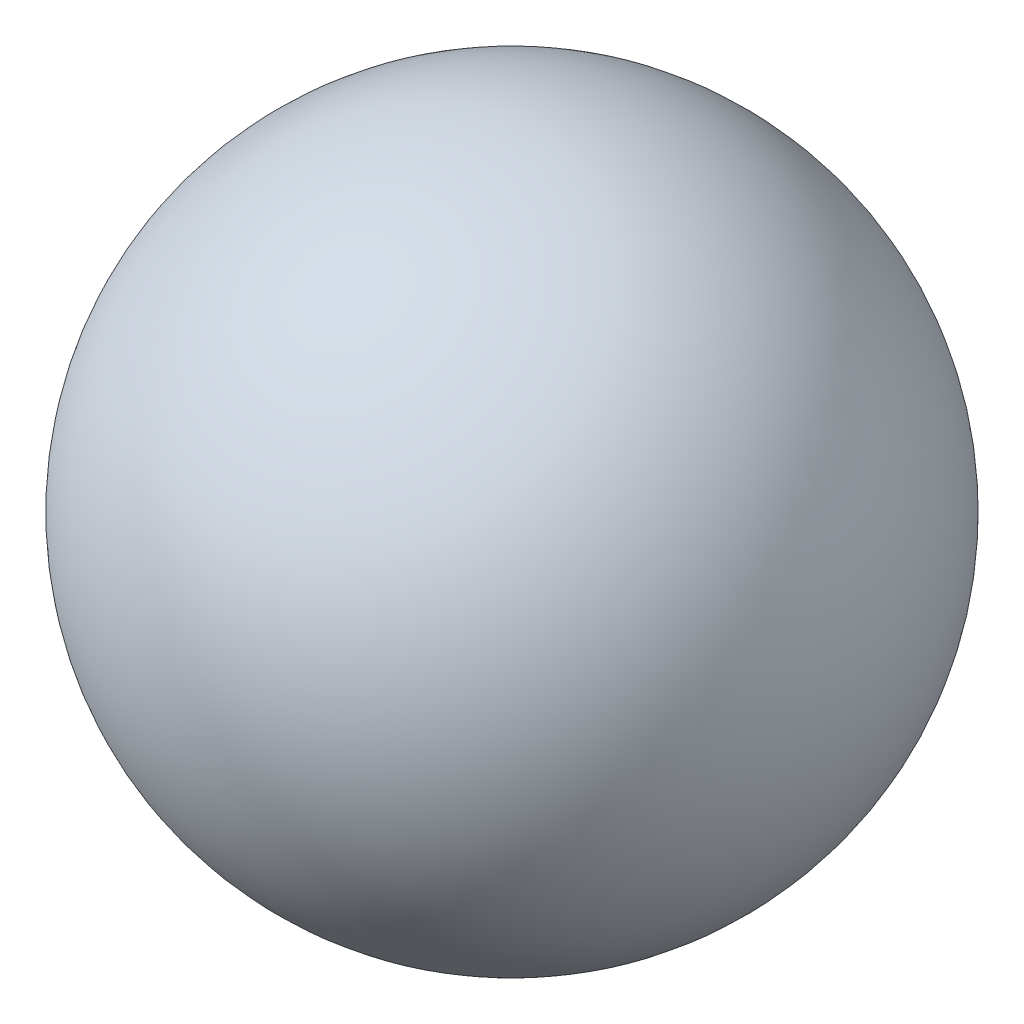
ISO-10303-21;
HEADER;
FILE_DESCRIPTION(('STEP AP214'),'2;1');
FILE_NAME('part.step','',(''),(''),'','','');
FILE_SCHEMA(('AUTOMOTIVE_DESIGN { 1 0 10303 214 1 1 1 1 }'));
ENDSEC;
DATA;
#1=APPLICATION_CONTEXT('core data for automotive mechanical design processes');
#2=APPLICATION_PROTOCOL_DEFINITION('international standard','automotive_design',2000,#1);
#3=PRODUCT_CONTEXT('',#1,'mechanical');
#4=PRODUCT('Part','Part','',(#3));
#5=PRODUCT_RELATED_PRODUCT_CATEGORY('part','',(#4));
#6=PRODUCT_DEFINITION_FORMATION('','',#4);
#7=PRODUCT_DEFINITION_CONTEXT('part definition',#1,'design');
#8=PRODUCT_DEFINITION('design','',#6,#7);
#9=PRODUCT_DEFINITION_SHAPE('','',#8);
#10=(LENGTH_UNIT() NAMED_UNIT(*) SI_UNIT(.MILLI.,.METRE.));
#11=(NAMED_UNIT(*) PLANE_ANGLE_UNIT() SI_UNIT($,.RADIAN.));
#12=(NAMED_UNIT(*) SI_UNIT($,.STERADIAN.) SOLID_ANGLE_UNIT());
#13=UNCERTAINTY_MEASURE_WITH_UNIT(LENGTH_MEASURE(1.E-05),#10,'distance_accuracy_value','');
#14=(GEOMETRIC_REPRESENTATION_CONTEXT(3) GLOBAL_UNCERTAINTY_ASSIGNED_CONTEXT((#13)) GLOBAL_UNIT_ASSIGNED_CONTEXT((#10,
#11,#12)) REPRESENTATION_CONTEXT('',''));
#15=CARTESIAN_POINT('',(0.,0.,0.));
#16=DIRECTION('',(0.,0.,1.));
#17=DIRECTION('',(1.,0.,0.));
#18=AXIS2_PLACEMENT_3D('',#15,#16,#17);
#19=CARTESIAN_POINT('',(0.,0.,0.));
#20=DIRECTION('',(0.,-1.,0.));
#21=DIRECTION('',(1.,0.,0.));
#22=AXIS2_PLACEMENT_3D('',#19,#20,#21);
#23=SPHERICAL_SURFACE('',#22,30.);
#24=CARTESIAN_POINT('',(0.,-30.,0.));
#25=VERTEX_POINT('',#24);
#26=VERTEX_LOOP('',#25);
#27=FACE_BOUND('',#26,.T.);
#28=ADVANCED_FACE('F33',(#27),#23,.T.);
#29=CLOSED_SHELL('',(#28));
#30=MANIFOLD_SOLID_BREP('B2',#29);
#31=ADVANCED_BREP_SHAPE_REPRESENTATION('',(#18,#30),#14);
#32=SHAPE_DEFINITION_REPRESENTATION(#9,#31);
ENDSEC;
END-ISO-10303-21;
